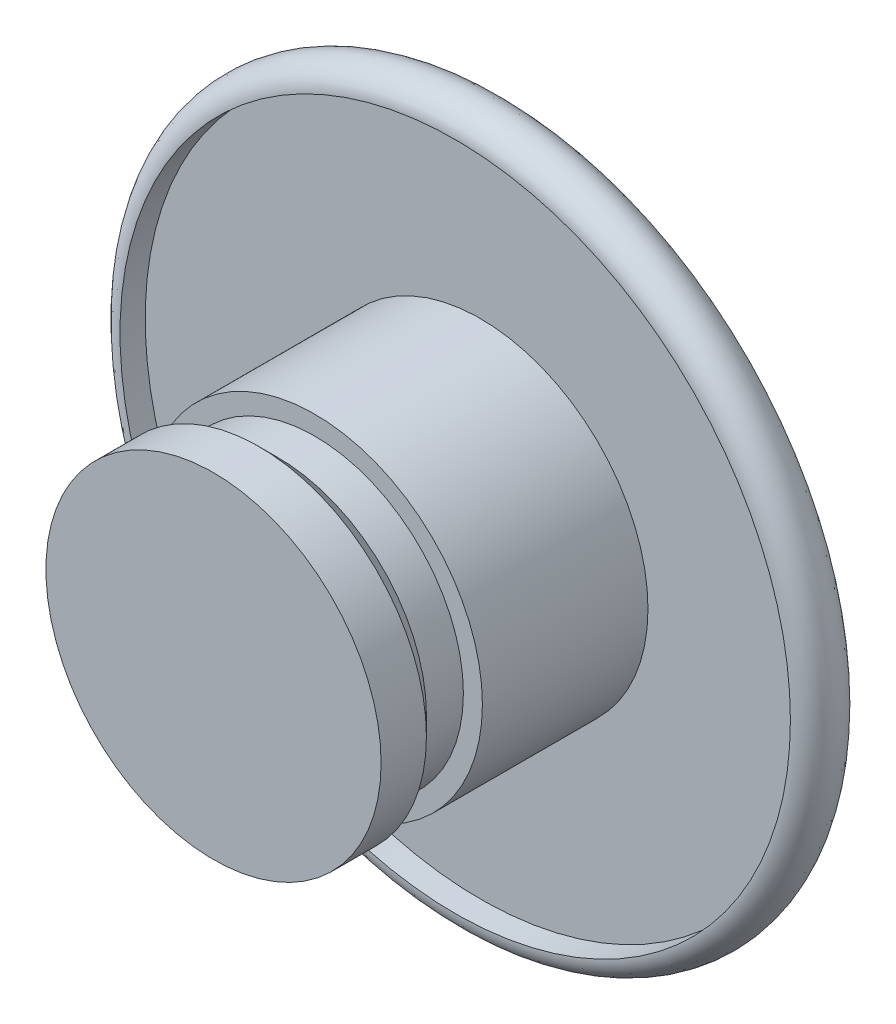
ISO-10303-21;
HEADER;
FILE_DESCRIPTION(('STEP AP214'),'2;1');
FILE_NAME('part.step','',(''),(''),'','','');
FILE_SCHEMA(('AUTOMOTIVE_DESIGN { 1 0 10303 214 1 1 1 1 }'));
ENDSEC;
DATA;
#1=APPLICATION_CONTEXT('core data for automotive mechanical design processes');
#2=APPLICATION_PROTOCOL_DEFINITION('international standard','automotive_design',2000,#1);
#3=PRODUCT_CONTEXT('',#1,'mechanical');
#4=PRODUCT('Part','Part','',(#3));
#5=PRODUCT_RELATED_PRODUCT_CATEGORY('part','',(#4));
#6=PRODUCT_DEFINITION_FORMATION('','',#4);
#7=PRODUCT_DEFINITION_CONTEXT('part definition',#1,'design');
#8=PRODUCT_DEFINITION('design','',#6,#7);
#9=PRODUCT_DEFINITION_SHAPE('','',#8);
#10=(LENGTH_UNIT() NAMED_UNIT(*) SI_UNIT(.MILLI.,.METRE.));
#11=(NAMED_UNIT(*) PLANE_ANGLE_UNIT() SI_UNIT($,.RADIAN.));
#12=(NAMED_UNIT(*) SI_UNIT($,.STERADIAN.) SOLID_ANGLE_UNIT());
#13=UNCERTAINTY_MEASURE_WITH_UNIT(LENGTH_MEASURE(1.E-05),#10,'distance_accuracy_value','');
#14=(GEOMETRIC_REPRESENTATION_CONTEXT(3) GLOBAL_UNCERTAINTY_ASSIGNED_CONTEXT((#13)) GLOBAL_UNIT_ASSIGNED_CONTEXT((#10,
#11,#12)) REPRESENTATION_CONTEXT('',''));
#15=CARTESIAN_POINT('',(0.,0.,0.));
#16=DIRECTION('',(0.,0.,1.));
#17=DIRECTION('',(1.,0.,0.));
#18=AXIS2_PLACEMENT_3D('',#15,#16,#17);
#19=CARTESIAN_POINT('',(0.,0.,-9.06474820143885));
#20=DIRECTION('',(0.,0.,1.));
#21=DIRECTION('',(1.,0.,0.));
#22=AXIS2_PLACEMENT_3D('',#19,#20,#21);
#23=PLANE('',#22);
#24=CARTESIAN_POINT('',(0.,15.,-9.06474820143885));
#25=DIRECTION('',(0.,0.,1.));
#26=DIRECTION('',(1.,0.,0.));
#27=AXIS2_PLACEMENT_3D('',#24,#25,#26);
#28=CIRCLE('',#27,15.);
#29=CARTESIAN_POINT('',(15.,15.,-9.06474820143885));
#30=VERTEX_POINT('',#29);
#31=EDGE_CURVE('E67',#30,#30,#28,.T.);
#32=ORIENTED_EDGE('',*,*,#31,.T.);
#33=EDGE_LOOP('',(#32));
#34=FACE_BOUND('',#33,.T.);
#35=CARTESIAN_POINT('',(0.,15.,-9.06474820143885));
#36=DIRECTION('',(0.,0.,1.));
#37=DIRECTION('',(1.,0.,0.));
#38=AXIS2_PLACEMENT_3D('',#35,#36,#37);
#39=CIRCLE('',#38,13.3);
#40=CARTESIAN_POINT('',(13.3,15.,-9.06474820143885));
#41=VERTEX_POINT('',#40);
#42=EDGE_CURVE('E42',#41,#41,#39,.T.);
#43=ORIENTED_EDGE('',*,*,#42,.F.);
#44=EDGE_LOOP('',(#43));
#45=FACE_BOUND('',#44,.T.);
#46=ADVANCED_FACE('F35',(#34,#45),#23,.T.);
#47=CARTESIAN_POINT('',(0.,15.,10.5475086170085));
#48=DIRECTION('',(0.,0.,1.));
#49=DIRECTION('',(1.,0.,0.));
#50=AXIS2_PLACEMENT_3D('',#47,#48,#49);
#51=CYLINDRICAL_SURFACE('',#50,13.3);
#52=ORIENTED_EDGE('',*,*,#42,.T.);
#53=EDGE_LOOP('',(#52));
#54=FACE_BOUND('',#53,.T.);
#55=CARTESIAN_POINT('',(0.,15.,-5.75539568345324));
#56=DIRECTION('',(0.,0.,1.));
#57=DIRECTION('',(1.,0.,0.));
#58=AXIS2_PLACEMENT_3D('',#55,#56,#57);
#59=CIRCLE('',#58,13.3);
#60=CARTESIAN_POINT('',(13.3,15.,-5.75539568345324));
#61=VERTEX_POINT('',#60);
#62=EDGE_CURVE('E46',#61,#61,#59,.T.);
#63=ORIENTED_EDGE('',*,*,#62,.F.);
#64=EDGE_LOOP('',(#63));
#65=FACE_BOUND('',#64,.T.);
#66=ADVANCED_FACE('F90',(#54,#65),#51,.T.);
#67=CARTESIAN_POINT('',(0.,15.,10.5475086170085));
#68=DIRECTION('',(0.,0.,1.));
#69=DIRECTION('',(1.,0.,0.));
#70=AXIS2_PLACEMENT_3D('',#67,#68,#69);
#71=CYLINDRICAL_SURFACE('',#70,15.);
#72=CARTESIAN_POINT('',(0.,15.,-4.05539568345323));
#73=DIRECTION('',(0.,0.,1.));
#74=DIRECTION('',(1.,0.,0.));
#75=AXIS2_PLACEMENT_3D('',#72,#73,#74);
#76=CIRCLE('',#75,15.);
#77=CARTESIAN_POINT('',(15.,15.,-4.05539568345323));
#78=VERTEX_POINT('',#77);
#79=EDGE_CURVE('E10',#78,#78,#76,.T.);
#80=ORIENTED_EDGE('',*,*,#79,.T.);
#81=EDGE_LOOP('',(#80));
#82=FACE_BOUND('',#81,.T.);
#83=CARTESIAN_POINT('',(0.,15.,0.));
#84=DIRECTION('',(0.,0.,1.));
#85=DIRECTION('',(1.,0.,0.));
#86=AXIS2_PLACEMENT_3D('',#83,#84,#85);
#87=CIRCLE('',#86,15.);
#88=CARTESIAN_POINT('',(15.,15.,0.));
#89=VERTEX_POINT('',#88);
#90=EDGE_CURVE('E50',#89,#89,#87,.T.);
#91=ORIENTED_EDGE('',*,*,#90,.F.);
#92=EDGE_LOOP('',(#91));
#93=FACE_BOUND('',#92,.T.);
#94=ADVANCED_FACE('F86',(#82,#93),#71,.T.);
#95=CARTESIAN_POINT('',(0.,0.,0.));
#96=DIRECTION('',(0.,0.,1.));
#97=DIRECTION('',(1.,0.,0.));
#98=AXIS2_PLACEMENT_3D('',#95,#96,#97);
#99=PLANE('',#98);
#100=ORIENTED_EDGE('',*,*,#90,.T.);
#101=EDGE_LOOP('',(#100));
#102=FACE_BOUND('',#101,.T.);
#103=ADVANCED_FACE('F82',(#102),#99,.T.);
#104=CARTESIAN_POINT('',(0.,0.,-26.1363107913669));
#105=DIRECTION('',(0.,0.,1.));
#106=DIRECTION('',(1.,0.,0.));
#107=AXIS2_PLACEMENT_3D('',#104,#105,#106);
#108=PLANE('',#107);
#109=CARTESIAN_POINT('',(0.,15.,-26.1363107913669));
#110=DIRECTION('',(0.,0.,1.));
#111=DIRECTION('',(1.,0.,0.));
#112=AXIS2_PLACEMENT_3D('',#109,#110,#111);
#113=CIRCLE('',#112,30.);
#114=CARTESIAN_POINT('',(30.,15.,-26.1363107913669));
#115=VERTEX_POINT('',#114);
#116=EDGE_CURVE('E55',#115,#115,#113,.T.);
#117=ORIENTED_EDGE('',*,*,#116,.F.);
#118=EDGE_LOOP('',(#117));
#119=FACE_BOUND('',#118,.T.);
#120=ADVANCED_FACE('F77',(#119),#108,.F.);
#121=CARTESIAN_POINT('',(0.,45.,-23.8848920863309));
#122=DIRECTION('',(1.,0.,0.));
#123=DIRECTION('',(0.,0.,-1.));
#124=AXIS2_PLACEMENT_3D('',#121,#122,#123);
#125=ELLIPSE('',#124,2.25141870503594,2.08788472912468);
#126=CARTESIAN_POINT('',(0.,15.,10.5475086170085));
#127=DIRECTION('',(0.,0.,1.));
#128=AXIS1_PLACEMENT('',#126,#127);
#129=SURFACE_OF_REVOLUTION('',#125,#128);
#130=CARTESIAN_POINT('',(0.,15.,-21.633473381295));
#131=DIRECTION('',(0.,0.,1.));
#132=DIRECTION('',(1.,0.,0.));
#133=AXIS2_PLACEMENT_3D('',#130,#131,#132);
#134=CIRCLE('',#133,30.);
#135=CARTESIAN_POINT('',(30.,15.,-21.633473381295));
#136=VERTEX_POINT('',#135);
#137=EDGE_CURVE('E58',#136,#136,#134,.T.);
#138=ORIENTED_EDGE('',*,*,#137,.F.);
#139=EDGE_LOOP('',(#138));
#140=FACE_BOUND('',#139,.T.);
#141=ORIENTED_EDGE('',*,*,#116,.T.);
#142=EDGE_LOOP('',(#141));
#143=FACE_BOUND('',#142,.T.);
#144=ADVANCED_FACE('F72',(#140,#143),#129,.T.);
#145=CARTESIAN_POINT('',(0.,15.,10.5475086170085));
#146=DIRECTION('',(0.,0.,1.));
#147=DIRECTION('',(1.,0.,0.));
#148=AXIS2_PLACEMENT_3D('',#145,#146,#147);
#149=CYLINDRICAL_SURFACE('',#148,30.);
#150=CARTESIAN_POINT('',(0.,15.,-23.8848920863309));
#151=DIRECTION('',(0.,0.,1.));
#152=DIRECTION('',(1.,0.,0.));
#153=AXIS2_PLACEMENT_3D('',#150,#151,#152);
#154=CIRCLE('',#153,30.);
#155=CARTESIAN_POINT('',(30.,15.,-23.8848920863309));
#156=VERTEX_POINT('',#155);
#157=EDGE_CURVE('E61',#156,#156,#154,.T.);
#158=ORIENTED_EDGE('',*,*,#157,.F.);
#159=EDGE_LOOP('',(#158));
#160=FACE_BOUND('',#159,.T.);
#161=ORIENTED_EDGE('',*,*,#137,.T.);
#162=EDGE_LOOP('',(#161));
#163=FACE_BOUND('',#162,.T.);
#164=ADVANCED_FACE('F76',(#160,#163),#149,.F.);
#165=CARTESIAN_POINT('',(0.,0.,-23.8848920863309));
#166=DIRECTION('',(0.,0.,1.));
#167=DIRECTION('',(1.,0.,0.));
#168=AXIS2_PLACEMENT_3D('',#165,#166,#167);
#169=PLANE('',#168);
#170=ORIENTED_EDGE('',*,*,#157,.T.);
#171=EDGE_LOOP('',(#170));
#172=FACE_BOUND('',#171,.T.);
#173=CARTESIAN_POINT('',(0.,15.,-23.8848920863309));
#174=DIRECTION('',(0.,0.,1.));
#175=DIRECTION('',(1.,0.,0.));
#176=AXIS2_PLACEMENT_3D('',#173,#174,#175);
#177=CIRCLE('',#176,15.);
#178=CARTESIAN_POINT('',(15.,15.,-23.8848920863309));
#179=VERTEX_POINT('',#178);
#180=EDGE_CURVE('E64',#179,#179,#177,.T.);
#181=ORIENTED_EDGE('',*,*,#180,.F.);
#182=EDGE_LOOP('',(#181));
#183=FACE_BOUND('',#182,.T.);
#184=ADVANCED_FACE('F101',(#172,#183),#169,.T.);
#185=CARTESIAN_POINT('',(0.,15.,10.5475086170085));
#186=DIRECTION('',(0.,0.,1.));
#187=DIRECTION('',(1.,0.,0.));
#188=AXIS2_PLACEMENT_3D('',#185,#186,#187);
#189=CYLINDRICAL_SURFACE('',#188,15.);
#190=ORIENTED_EDGE('',*,*,#180,.T.);
#191=EDGE_LOOP('',(#190));
#192=FACE_BOUND('',#191,.T.);
#193=ORIENTED_EDGE('',*,*,#31,.F.);
#194=EDGE_LOOP('',(#193));
#195=FACE_BOUND('',#194,.T.);
#196=ADVANCED_FACE('F99',(#192,#195),#189,.T.);
#197=CARTESIAN_POINT('',(0.,15.,-4.05539568345323));
#198=DIRECTION('',(0.,0.,1.));
#199=DIRECTION('',(1.,0.,0.));
#200=AXIS2_PLACEMENT_3D('',#197,#198,#199);
#201=CONICAL_SURFACE('',#200,15.,0.785398163397449);
#202=ORIENTED_EDGE('',*,*,#62,.T.);
#203=EDGE_LOOP('',(#202));
#204=FACE_BOUND('',#203,.T.);
#205=ORIENTED_EDGE('',*,*,#79,.F.);
#206=EDGE_LOOP('',(#205));
#207=FACE_BOUND('',#206,.T.);
#208=ADVANCED_FACE('F37',(#204,#207),#201,.T.);
#209=CLOSED_SHELL('',(#46,#66,#94,#103,#120,#144,#164,#184,#196,#208));
#210=MANIFOLD_SOLID_BREP('B2',#209);
#211=ADVANCED_BREP_SHAPE_REPRESENTATION('',(#18,#210),#14);
#212=SHAPE_DEFINITION_REPRESENTATION(#9,#211);
ENDSEC;
END-ISO-10303-21;
